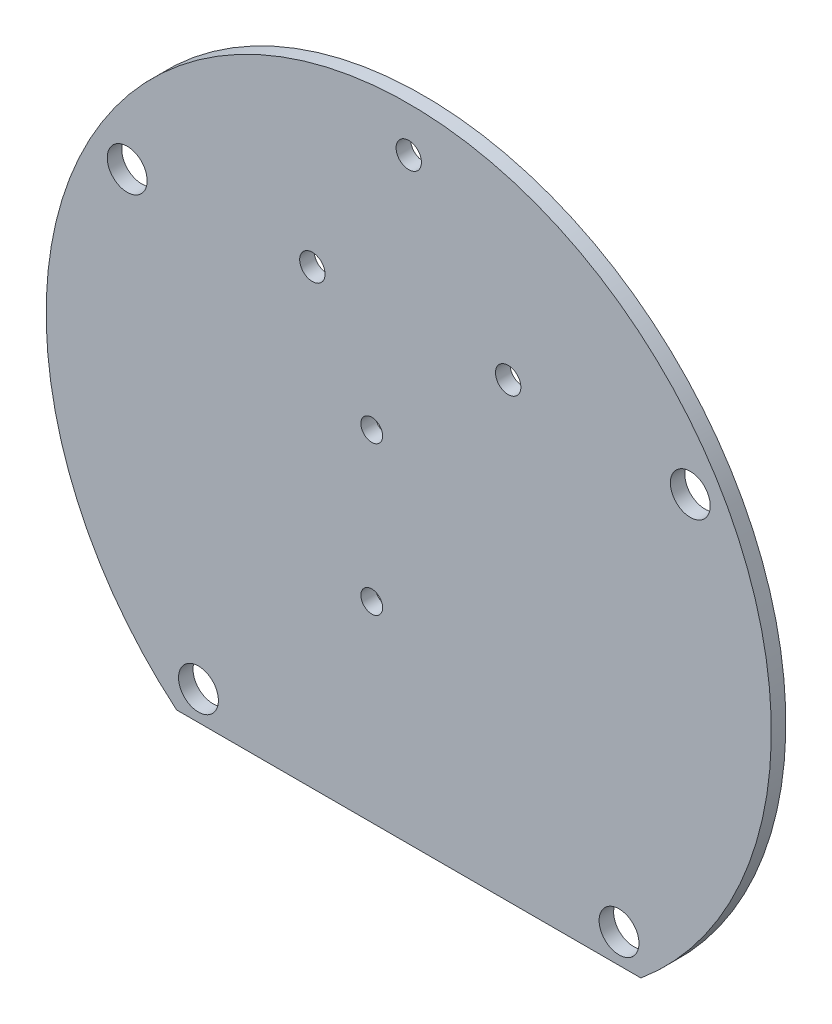
ISO-10303-21;
HEADER;
FILE_DESCRIPTION(('STEP AP214'),'2;1');
FILE_NAME('part.step','',(''),(''),'','','');
FILE_SCHEMA(('AUTOMOTIVE_DESIGN { 1 0 10303 214 1 1 1 1 }'));
ENDSEC;
DATA;
#1=APPLICATION_CONTEXT('core data for automotive mechanical design processes');
#2=APPLICATION_PROTOCOL_DEFINITION('international standard','automotive_design',2000,#1);
#3=PRODUCT_CONTEXT('',#1,'mechanical');
#4=PRODUCT('Part','Part','',(#3));
#5=PRODUCT_RELATED_PRODUCT_CATEGORY('part','',(#4));
#6=PRODUCT_DEFINITION_FORMATION('','',#4);
#7=PRODUCT_DEFINITION_CONTEXT('part definition',#1,'design');
#8=PRODUCT_DEFINITION('design','',#6,#7);
#9=PRODUCT_DEFINITION_SHAPE('','',#8);
#10=(LENGTH_UNIT() NAMED_UNIT(*) SI_UNIT(.MILLI.,.METRE.));
#11=(NAMED_UNIT(*) PLANE_ANGLE_UNIT() SI_UNIT($,.RADIAN.));
#12=(NAMED_UNIT(*) SI_UNIT($,.STERADIAN.) SOLID_ANGLE_UNIT());
#13=UNCERTAINTY_MEASURE_WITH_UNIT(LENGTH_MEASURE(1.E-05),#10,'distance_accuracy_value','');
#14=(GEOMETRIC_REPRESENTATION_CONTEXT(3) GLOBAL_UNCERTAINTY_ASSIGNED_CONTEXT((#13)) GLOBAL_UNIT_ASSIGNED_CONTEXT((#10,
#11,#12)) REPRESENTATION_CONTEXT('',''));
#15=CARTESIAN_POINT('',(0.,0.,0.));
#16=DIRECTION('',(0.,0.,1.));
#17=DIRECTION('',(1.,0.,0.));
#18=AXIS2_PLACEMENT_3D('',#15,#16,#17);
#19=CARTESIAN_POINT('',(0.,0.,2.));
#20=DIRECTION('',(0.,0.,-1.));
#21=DIRECTION('',(-1.,0.,0.));
#22=AXIS2_PLACEMENT_3D('',#19,#20,#21);
#23=CYLINDRICAL_SURFACE('',#22,50.);
#24=DIRECTION('',(0.,0.,-1.));
#25=VECTOR('',#24,1.);
#26=CARTESIAN_POINT('',(-32.0113353588168,-38.4093010681705,2.));
#27=LINE('',#26,#25);
#28=CARTESIAN_POINT('',(-32.0113353588168,-38.4093010681705,2.));
#29=VERTEX_POINT('',#28);
#30=CARTESIAN_POINT('',(-32.0113353588168,-38.4093010681705,0.));
#31=VERTEX_POINT('',#30);
#32=EDGE_CURVE('E55',#29,#31,#27,.T.);
#33=ORIENTED_EDGE('',*,*,#32,.F.);
#34=CARTESIAN_POINT('',(0.,0.,2.));
#35=DIRECTION('',(0.,0.,1.));
#36=DIRECTION('',(1.,0.,0.));
#37=AXIS2_PLACEMENT_3D('',#34,#35,#36);
#38=CIRCLE('',#37,50.);
#39=CARTESIAN_POINT('',(32.0113353588168,-38.4093010681705,2.));
#40=VERTEX_POINT('',#39);
#41=EDGE_CURVE('E49',#40,#29,#38,.T.);
#42=ORIENTED_EDGE('',*,*,#41,.F.);
#43=DIRECTION('',(0.,0.,-1.));
#44=VECTOR('',#43,1.);
#45=CARTESIAN_POINT('',(32.0113353588168,-38.4093010681705,2.));
#46=LINE('',#45,#44);
#47=CARTESIAN_POINT('',(32.0113353588168,-38.4093010681705,0.));
#48=VERTEX_POINT('',#47);
#49=EDGE_CURVE('E66',#48,#40,#46,.F.);
#50=ORIENTED_EDGE('',*,*,#49,.F.);
#51=CARTESIAN_POINT('',(0.,0.,0.));
#52=DIRECTION('',(0.,0.,1.));
#53=DIRECTION('',(1.,0.,0.));
#54=AXIS2_PLACEMENT_3D('',#51,#52,#53);
#55=CIRCLE('',#54,50.);
#56=EDGE_CURVE('E72',#48,#31,#55,.T.);
#57=ORIENTED_EDGE('',*,*,#56,.T.);
#58=EDGE_LOOP('',(#33,#42,#50,#57));
#59=FACE_BOUND('',#58,.T.);
#60=ADVANCED_FACE('F41',(#59),#23,.T.);
#61=CARTESIAN_POINT('',(0.,0.,2.));
#62=DIRECTION('',(0.,0.,1.));
#63=DIRECTION('',(1.,0.,0.));
#64=AXIS2_PLACEMENT_3D('',#61,#62,#63);
#65=PLANE('',#64);
#66=CARTESIAN_POINT('',(-5.09999999999999,-12.,2.));
#67=DIRECTION('',(0.,0.,1.));
#68=DIRECTION('',(1.,0.,0.));
#69=AXIS2_PLACEMENT_3D('',#66,#67,#68);
#70=CIRCLE('',#69,1.5);
#71=CARTESIAN_POINT('',(-3.59999999999999,-12.,2.));
#72=VERTEX_POINT('',#71);
#73=EDGE_CURVE('E75',#72,#72,#70,.T.);
#74=ORIENTED_EDGE('',*,*,#73,.F.);
#75=EDGE_LOOP('',(#74));
#76=FACE_BOUND('',#75,.T.);
#77=CARTESIAN_POINT('',(13.71,23.86,2.));
#78=DIRECTION('',(0.,0.,1.));
#79=DIRECTION('',(1.,0.,0.));
#80=AXIS2_PLACEMENT_3D('',#77,#78,#79);
#81=CIRCLE('',#80,1.75);
#82=CARTESIAN_POINT('',(15.46,23.86,2.));
#83=VERTEX_POINT('',#82);
#84=EDGE_CURVE('E121',#83,#83,#81,.T.);
#85=ORIENTED_EDGE('',*,*,#84,.F.);
#86=EDGE_LOOP('',(#85));
#87=FACE_BOUND('',#86,.T.);
#88=CARTESIAN_POINT('',(-13.29,23.86,2.));
#89=DIRECTION('',(0.,0.,1.));
#90=DIRECTION('',(1.,0.,0.));
#91=AXIS2_PLACEMENT_3D('',#88,#89,#90);
#92=CIRCLE('',#91,1.75);
#93=CARTESIAN_POINT('',(-11.54,23.86,2.));
#94=VERTEX_POINT('',#93);
#95=EDGE_CURVE('E125',#94,#94,#92,.T.);
#96=ORIENTED_EDGE('',*,*,#95,.F.);
#97=EDGE_LOOP('',(#96));
#98=FACE_BOUND('',#97,.T.);
#99=CARTESIAN_POINT('',(0.,43.86,2.));
#100=DIRECTION('',(0.,0.,1.));
#101=DIRECTION('',(1.,0.,0.));
#102=AXIS2_PLACEMENT_3D('',#99,#100,#101);
#103=CIRCLE('',#102,1.75);
#104=CARTESIAN_POINT('',(1.75000000000002,43.86,2.));
#105=VERTEX_POINT('',#104);
#106=EDGE_CURVE('E129',#105,#105,#103,.T.);
#107=ORIENTED_EDGE('',*,*,#106,.F.);
#108=EDGE_LOOP('',(#107));
#109=FACE_BOUND('',#108,.T.);
#110=CARTESIAN_POINT('',(-5.09999999999999,8.49999999999999,2.));
#111=DIRECTION('',(0.,0.,1.));
#112=DIRECTION('',(1.,0.,0.));
#113=AXIS2_PLACEMENT_3D('',#110,#111,#112);
#114=CIRCLE('',#113,1.5);
#115=CARTESIAN_POINT('',(-3.59999999999999,8.49999999999999,2.));
#116=VERTEX_POINT('',#115);
#117=EDGE_CURVE('E133',#116,#116,#114,.T.);
#118=ORIENTED_EDGE('',*,*,#117,.F.);
#119=EDGE_LOOP('',(#118));
#120=FACE_BOUND('',#119,.T.);
#121=CARTESIAN_POINT('',(38.8241975308642,22.7526193235952,2.));
#122=DIRECTION('',(0.,0.,1.));
#123=DIRECTION('',(1.,0.,0.));
#124=AXIS2_PLACEMENT_3D('',#121,#122,#123);
#125=CIRCLE('',#124,2.75);
#126=CARTESIAN_POINT('',(41.5741975308642,22.7526193235952,2.));
#127=VERTEX_POINT('',#126);
#128=EDGE_CURVE('E91',#127,#127,#125,.T.);
#129=ORIENTED_EDGE('',*,*,#128,.F.);
#130=EDGE_LOOP('',(#129));
#131=FACE_BOUND('',#130,.T.);
#132=CARTESIAN_POINT('',(-38.8241975308642,22.7526193235952,2.));
#133=DIRECTION('',(0.,0.,1.));
#134=DIRECTION('',(1.,0.,0.));
#135=AXIS2_PLACEMENT_3D('',#132,#133,#134);
#136=CIRCLE('',#135,2.75);
#137=CARTESIAN_POINT('',(-36.0741975308642,22.7526193235952,2.));
#138=VERTEX_POINT('',#137);
#139=EDGE_CURVE('E99',#138,#138,#136,.T.);
#140=ORIENTED_EDGE('',*,*,#139,.F.);
#141=EDGE_LOOP('',(#140));
#142=FACE_BOUND('',#141,.T.);
#143=CARTESIAN_POINT('',(29.,-34.4093010681705,2.));
#144=DIRECTION('',(0.,0.,1.));
#145=DIRECTION('',(1.,0.,0.));
#146=AXIS2_PLACEMENT_3D('',#143,#144,#145);
#147=CIRCLE('',#146,2.75);
#148=CARTESIAN_POINT('',(31.75,-34.4093010681705,2.));
#149=VERTEX_POINT('',#148);
#150=EDGE_CURVE('E107',#149,#149,#147,.T.);
#151=ORIENTED_EDGE('',*,*,#150,.F.);
#152=EDGE_LOOP('',(#151));
#153=FACE_BOUND('',#152,.T.);
#154=CARTESIAN_POINT('',(-29.,-34.4093010681705,2.));
#155=DIRECTION('',(0.,0.,1.));
#156=DIRECTION('',(1.,0.,0.));
#157=AXIS2_PLACEMENT_3D('',#154,#155,#156);
#158=CIRCLE('',#157,2.75);
#159=CARTESIAN_POINT('',(-26.25,-34.4093010681705,2.));
#160=VERTEX_POINT('',#159);
#161=EDGE_CURVE('E84',#160,#160,#158,.T.);
#162=ORIENTED_EDGE('',*,*,#161,.F.);
#163=EDGE_LOOP('',(#162));
#164=FACE_BOUND('',#163,.T.);
#165=ORIENTED_EDGE('',*,*,#41,.T.);
#166=DIRECTION('',(1.,0.,0.));
#167=VECTOR('',#166,1.);
#168=CARTESIAN_POINT('',(0.,-38.4093010681705,2.));
#169=LINE('',#168,#167);
#170=EDGE_CURVE('E60',#29,#40,#169,.T.);
#171=ORIENTED_EDGE('',*,*,#170,.T.);
#172=EDGE_LOOP('',(#165,#171));
#173=FACE_BOUND('',#172,.T.);
#174=ADVANCED_FACE('F163',(#76,#87,#98,#109,#120,#131,#142,#153,#164,#173),#65,.T.);
#175=CARTESIAN_POINT('',(0.,0.,0.));
#176=DIRECTION('',(0.,0.,1.));
#177=DIRECTION('',(1.,0.,0.));
#178=AXIS2_PLACEMENT_3D('',#175,#176,#177);
#179=PLANE('',#178);
#180=CARTESIAN_POINT('',(-5.09999999999999,-12.,0.));
#181=DIRECTION('',(0.,0.,-1.));
#182=DIRECTION('',(-1.,0.,0.));
#183=AXIS2_PLACEMENT_3D('',#180,#181,#182);
#184=CIRCLE('',#183,1.5);
#185=CARTESIAN_POINT('',(-6.59999999999999,-12.,0.));
#186=VERTEX_POINT('',#185);
#187=EDGE_CURVE('E141',#186,#186,#184,.T.);
#188=ORIENTED_EDGE('',*,*,#187,.F.);
#189=EDGE_LOOP('',(#188));
#190=FACE_BOUND('',#189,.T.);
#191=CARTESIAN_POINT('',(13.71,23.86,0.));
#192=DIRECTION('',(0.,0.,-1.));
#193=DIRECTION('',(-1.,0.,0.));
#194=AXIS2_PLACEMENT_3D('',#191,#192,#193);
#195=CIRCLE('',#194,1.75);
#196=CARTESIAN_POINT('',(11.96,23.86,0.));
#197=VERTEX_POINT('',#196);
#198=EDGE_CURVE('E142',#197,#197,#195,.T.);
#199=ORIENTED_EDGE('',*,*,#198,.F.);
#200=EDGE_LOOP('',(#199));
#201=FACE_BOUND('',#200,.T.);
#202=CARTESIAN_POINT('',(-13.29,23.86,0.));
#203=DIRECTION('',(0.,0.,-1.));
#204=DIRECTION('',(-1.,0.,0.));
#205=AXIS2_PLACEMENT_3D('',#202,#203,#204);
#206=CIRCLE('',#205,1.75);
#207=CARTESIAN_POINT('',(-15.04,23.86,0.));
#208=VERTEX_POINT('',#207);
#209=EDGE_CURVE('E146',#208,#208,#206,.T.);
#210=ORIENTED_EDGE('',*,*,#209,.F.);
#211=EDGE_LOOP('',(#210));
#212=FACE_BOUND('',#211,.T.);
#213=CARTESIAN_POINT('',(0.,43.86,0.));
#214=DIRECTION('',(0.,0.,-1.));
#215=DIRECTION('',(-1.,0.,0.));
#216=AXIS2_PLACEMENT_3D('',#213,#214,#215);
#217=CIRCLE('',#216,1.75);
#218=CARTESIAN_POINT('',(-1.74999999999998,43.86,0.));
#219=VERTEX_POINT('',#218);
#220=EDGE_CURVE('E150',#219,#219,#217,.T.);
#221=ORIENTED_EDGE('',*,*,#220,.F.);
#222=EDGE_LOOP('',(#221));
#223=FACE_BOUND('',#222,.T.);
#224=CARTESIAN_POINT('',(-5.09999999999999,8.49999999999999,0.));
#225=DIRECTION('',(0.,0.,-1.));
#226=DIRECTION('',(-1.,0.,0.));
#227=AXIS2_PLACEMENT_3D('',#224,#225,#226);
#228=CIRCLE('',#227,1.5);
#229=CARTESIAN_POINT('',(-6.59999999999999,8.49999999999999,0.));
#230=VERTEX_POINT('',#229);
#231=EDGE_CURVE('E137',#230,#230,#228,.T.);
#232=ORIENTED_EDGE('',*,*,#231,.F.);
#233=EDGE_LOOP('',(#232));
#234=FACE_BOUND('',#233,.T.);
#235=CARTESIAN_POINT('',(-29.,-34.4093010681705,0.));
#236=DIRECTION('',(0.,0.,1.));
#237=DIRECTION('',(1.,0.,0.));
#238=AXIS2_PLACEMENT_3D('',#235,#236,#237);
#239=CIRCLE('',#238,2.75);
#240=CARTESIAN_POINT('',(-26.25,-34.4093010681705,0.));
#241=VERTEX_POINT('',#240);
#242=EDGE_CURVE('E79',#241,#241,#239,.T.);
#243=ORIENTED_EDGE('',*,*,#242,.T.);
#244=EDGE_LOOP('',(#243));
#245=FACE_BOUND('',#244,.T.);
#246=CARTESIAN_POINT('',(29.,-34.4093010681705,0.));
#247=DIRECTION('',(0.,0.,1.));
#248=DIRECTION('',(1.,0.,0.));
#249=AXIS2_PLACEMENT_3D('',#246,#247,#248);
#250=CIRCLE('',#249,2.75);
#251=CARTESIAN_POINT('',(31.75,-34.4093010681705,0.));
#252=VERTEX_POINT('',#251);
#253=EDGE_CURVE('E89',#252,#252,#250,.T.);
#254=ORIENTED_EDGE('',*,*,#253,.T.);
#255=EDGE_LOOP('',(#254));
#256=FACE_BOUND('',#255,.T.);
#257=CARTESIAN_POINT('',(-38.8241975308642,22.7526193235952,0.));
#258=DIRECTION('',(0.,0.,1.));
#259=DIRECTION('',(1.,0.,0.));
#260=AXIS2_PLACEMENT_3D('',#257,#258,#259);
#261=CIRCLE('',#260,2.75);
#262=CARTESIAN_POINT('',(-36.0741975308642,22.7526193235952,0.));
#263=VERTEX_POINT('',#262);
#264=EDGE_CURVE('E103',#263,#263,#261,.T.);
#265=ORIENTED_EDGE('',*,*,#264,.T.);
#266=EDGE_LOOP('',(#265));
#267=FACE_BOUND('',#266,.T.);
#268=CARTESIAN_POINT('',(38.8241975308642,22.7526193235952,0.));
#269=DIRECTION('',(0.,0.,1.));
#270=DIRECTION('',(1.,0.,0.));
#271=AXIS2_PLACEMENT_3D('',#268,#269,#270);
#272=CIRCLE('',#271,2.75);
#273=CARTESIAN_POINT('',(41.5741975308642,22.7526193235952,0.));
#274=VERTEX_POINT('',#273);
#275=EDGE_CURVE('E95',#274,#274,#272,.T.);
#276=ORIENTED_EDGE('',*,*,#275,.T.);
#277=EDGE_LOOP('',(#276));
#278=FACE_BOUND('',#277,.T.);
#279=DIRECTION('',(1.,0.,0.));
#280=VECTOR('',#279,1.);
#281=CARTESIAN_POINT('',(0.,-38.4093010681705,0.));
#282=LINE('',#281,#280);
#283=EDGE_CURVE('E11',#31,#48,#282,.T.);
#284=ORIENTED_EDGE('',*,*,#283,.F.);
#285=ORIENTED_EDGE('',*,*,#56,.F.);
#286=EDGE_LOOP('',(#284,#285));
#287=FACE_BOUND('',#286,.T.);
#288=ADVANCED_FACE('F77',(#190,#201,#212,#223,#234,#245,#256,#267,#278,#287),#179,.F.);
#289=CARTESIAN_POINT('',(-29.,-34.4093010681705,0.));
#290=DIRECTION('',(0.,0.,1.));
#291=DIRECTION('',(1.,0.,0.));
#292=AXIS2_PLACEMENT_3D('',#289,#290,#291);
#293=CYLINDRICAL_SURFACE('',#292,2.75);
#294=ORIENTED_EDGE('',*,*,#242,.F.);
#295=EDGE_LOOP('',(#294));
#296=FACE_BOUND('',#295,.T.);
#297=ORIENTED_EDGE('',*,*,#161,.T.);
#298=EDGE_LOOP('',(#297));
#299=FACE_BOUND('',#298,.T.);
#300=ADVANCED_FACE('F162',(#296,#299),#293,.F.);
#301=CARTESIAN_POINT('',(29.,-34.4093010681705,0.));
#302=DIRECTION('',(0.,0.,1.));
#303=DIRECTION('',(1.,0.,0.));
#304=AXIS2_PLACEMENT_3D('',#301,#302,#303);
#305=CYLINDRICAL_SURFACE('',#304,2.75);
#306=ORIENTED_EDGE('',*,*,#253,.F.);
#307=EDGE_LOOP('',(#306));
#308=FACE_BOUND('',#307,.T.);
#309=ORIENTED_EDGE('',*,*,#150,.T.);
#310=EDGE_LOOP('',(#309));
#311=FACE_BOUND('',#310,.T.);
#312=ADVANCED_FACE('F196',(#308,#311),#305,.F.);
#313=CARTESIAN_POINT('',(-38.8241975308642,22.7526193235952,0.));
#314=DIRECTION('',(0.,0.,1.));
#315=DIRECTION('',(1.,0.,0.));
#316=AXIS2_PLACEMENT_3D('',#313,#314,#315);
#317=CYLINDRICAL_SURFACE('',#316,2.75);
#318=ORIENTED_EDGE('',*,*,#264,.F.);
#319=EDGE_LOOP('',(#318));
#320=FACE_BOUND('',#319,.T.);
#321=ORIENTED_EDGE('',*,*,#139,.T.);
#322=EDGE_LOOP('',(#321));
#323=FACE_BOUND('',#322,.T.);
#324=ADVANCED_FACE('F180',(#320,#323),#317,.F.);
#325=CARTESIAN_POINT('',(38.8241975308642,22.7526193235952,0.));
#326=DIRECTION('',(0.,0.,1.));
#327=DIRECTION('',(1.,0.,0.));
#328=AXIS2_PLACEMENT_3D('',#325,#326,#327);
#329=CYLINDRICAL_SURFACE('',#328,2.75);
#330=ORIENTED_EDGE('',*,*,#275,.F.);
#331=EDGE_LOOP('',(#330));
#332=FACE_BOUND('',#331,.T.);
#333=ORIENTED_EDGE('',*,*,#128,.T.);
#334=EDGE_LOOP('',(#333));
#335=FACE_BOUND('',#334,.T.);
#336=ADVANCED_FACE('F177',(#332,#335),#329,.F.);
#337=CARTESIAN_POINT('',(-40.7238599785686,-38.4093010681705,2.000012));
#338=DIRECTION('',(0.,-1.,0.));
#339=DIRECTION('',(0.,0.,-1.));
#340=AXIS2_PLACEMENT_3D('',#337,#338,#339);
#341=PLANE('',#340);
#342=ORIENTED_EDGE('',*,*,#32,.T.);
#343=ORIENTED_EDGE('',*,*,#283,.T.);
#344=ORIENTED_EDGE('',*,*,#49,.T.);
#345=ORIENTED_EDGE('',*,*,#170,.F.);
#346=EDGE_LOOP('',(#342,#343,#344,#345));
#347=FACE_BOUND('',#346,.T.);
#348=ADVANCED_FACE('F65',(#347),#341,.T.);
#349=CARTESIAN_POINT('',(-5.09999999999999,8.49999999999999,10.));
#350=DIRECTION('',(0.,0.,-1.));
#351=DIRECTION('',(-1.,0.,0.));
#352=AXIS2_PLACEMENT_3D('',#349,#350,#351);
#353=CYLINDRICAL_SURFACE('',#352,1.5);
#354=ORIENTED_EDGE('',*,*,#117,.T.);
#355=EDGE_LOOP('',(#354));
#356=FACE_BOUND('',#355,.T.);
#357=ORIENTED_EDGE('',*,*,#231,.T.);
#358=EDGE_LOOP('',(#357));
#359=FACE_BOUND('',#358,.T.);
#360=ADVANCED_FACE('F227',(#356,#359),#353,.F.);
#361=CARTESIAN_POINT('',(0.,43.86,10.));
#362=DIRECTION('',(0.,0.,-1.));
#363=DIRECTION('',(-1.,0.,0.));
#364=AXIS2_PLACEMENT_3D('',#361,#362,#363);
#365=CYLINDRICAL_SURFACE('',#364,1.75);
#366=ORIENTED_EDGE('',*,*,#106,.T.);
#367=EDGE_LOOP('',(#366));
#368=FACE_BOUND('',#367,.T.);
#369=ORIENTED_EDGE('',*,*,#220,.T.);
#370=EDGE_LOOP('',(#369));
#371=FACE_BOUND('',#370,.T.);
#372=ADVANCED_FACE('F232',(#368,#371),#365,.F.);
#373=CARTESIAN_POINT('',(-13.29,23.86,10.));
#374=DIRECTION('',(0.,0.,-1.));
#375=DIRECTION('',(-1.,0.,0.));
#376=AXIS2_PLACEMENT_3D('',#373,#374,#375);
#377=CYLINDRICAL_SURFACE('',#376,1.75);
#378=ORIENTED_EDGE('',*,*,#95,.T.);
#379=EDGE_LOOP('',(#378));
#380=FACE_BOUND('',#379,.T.);
#381=ORIENTED_EDGE('',*,*,#209,.T.);
#382=EDGE_LOOP('',(#381));
#383=FACE_BOUND('',#382,.T.);
#384=ADVANCED_FACE('F158',(#380,#383),#377,.F.);
#385=CARTESIAN_POINT('',(13.71,23.86,10.));
#386=DIRECTION('',(0.,0.,-1.));
#387=DIRECTION('',(-1.,0.,0.));
#388=AXIS2_PLACEMENT_3D('',#385,#386,#387);
#389=CYLINDRICAL_SURFACE('',#388,1.75);
#390=ORIENTED_EDGE('',*,*,#84,.T.);
#391=EDGE_LOOP('',(#390));
#392=FACE_BOUND('',#391,.T.);
#393=ORIENTED_EDGE('',*,*,#198,.T.);
#394=EDGE_LOOP('',(#393));
#395=FACE_BOUND('',#394,.T.);
#396=ADVANCED_FACE('F253',(#392,#395),#389,.F.);
#397=CARTESIAN_POINT('',(-5.09999999999999,-12.,10.));
#398=DIRECTION('',(0.,0.,-1.));
#399=DIRECTION('',(-1.,0.,0.));
#400=AXIS2_PLACEMENT_3D('',#397,#398,#399);
#401=CYLINDRICAL_SURFACE('',#400,1.5);
#402=ORIENTED_EDGE('',*,*,#73,.T.);
#403=EDGE_LOOP('',(#402));
#404=FACE_BOUND('',#403,.T.);
#405=ORIENTED_EDGE('',*,*,#187,.T.);
#406=EDGE_LOOP('',(#405));
#407=FACE_BOUND('',#406,.T.);
#408=ADVANCED_FACE('F263',(#404,#407),#401,.F.);
#409=CLOSED_SHELL('',(#60,#174,#288,#300,#312,#324,#336,#348,#360,#372,#384,#396,#408));
#410=MANIFOLD_SOLID_BREP('B2',#409);
#411=ADVANCED_BREP_SHAPE_REPRESENTATION('',(#18,#410),#14);
#412=SHAPE_DEFINITION_REPRESENTATION(#9,#411);
ENDSEC;
END-ISO-10303-21;
